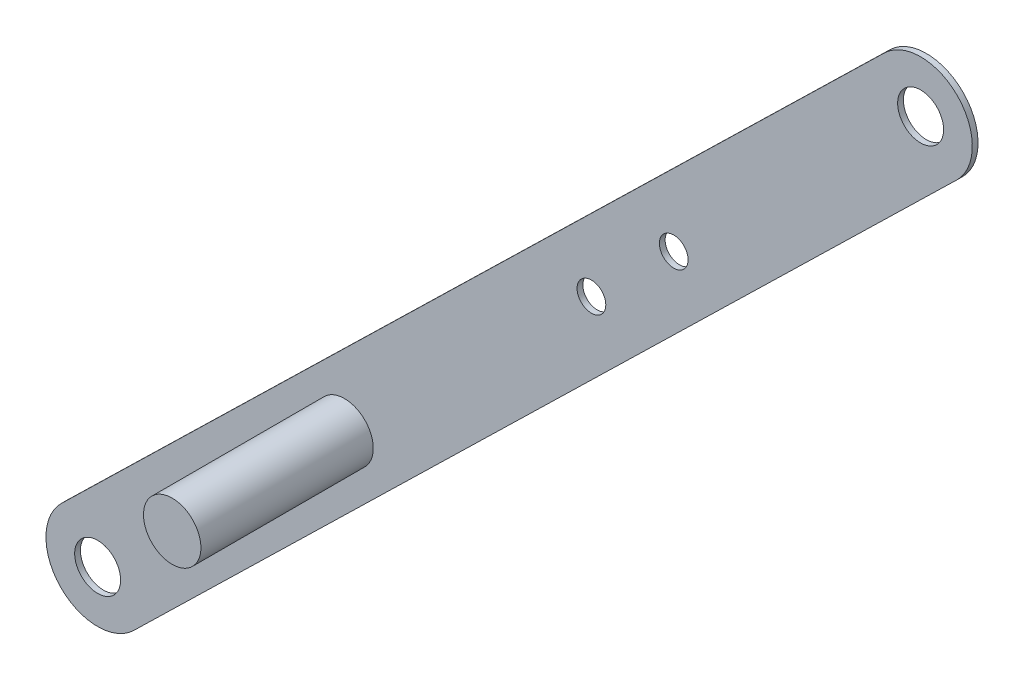
ISO-10303-21;
HEADER;
FILE_DESCRIPTION(('STEP AP214'),'2;1');
FILE_NAME('part.step','',(''),(''),'','','');
FILE_SCHEMA(('AUTOMOTIVE_DESIGN { 1 0 10303 214 1 1 1 1 }'));
ENDSEC;
DATA;
#1=APPLICATION_CONTEXT('core data for automotive mechanical design processes');
#2=APPLICATION_PROTOCOL_DEFINITION('international standard','automotive_design',2000,#1);
#3=PRODUCT_CONTEXT('',#1,'mechanical');
#4=PRODUCT('Part','Part','',(#3));
#5=PRODUCT_RELATED_PRODUCT_CATEGORY('part','',(#4));
#6=PRODUCT_DEFINITION_FORMATION('','',#4);
#7=PRODUCT_DEFINITION_CONTEXT('part definition',#1,'design');
#8=PRODUCT_DEFINITION('design','',#6,#7);
#9=PRODUCT_DEFINITION_SHAPE('','',#8);
#10=(LENGTH_UNIT() NAMED_UNIT(*) SI_UNIT(.MILLI.,.METRE.));
#11=(NAMED_UNIT(*) PLANE_ANGLE_UNIT() SI_UNIT($,.RADIAN.));
#12=(NAMED_UNIT(*) SI_UNIT($,.STERADIAN.) SOLID_ANGLE_UNIT());
#13=UNCERTAINTY_MEASURE_WITH_UNIT(LENGTH_MEASURE(1.E-05),#10,'distance_accuracy_value','');
#14=(GEOMETRIC_REPRESENTATION_CONTEXT(3) GLOBAL_UNCERTAINTY_ASSIGNED_CONTEXT((#13)) GLOBAL_UNIT_ASSIGNED_CONTEXT((#10,
#11,#12)) REPRESENTATION_CONTEXT('',''));
#15=CARTESIAN_POINT('',(0.,0.,0.));
#16=DIRECTION('',(0.,0.,1.));
#17=DIRECTION('',(1.,0.,0.));
#18=AXIS2_PLACEMENT_3D('',#15,#16,#17);
#19=CARTESIAN_POINT('',(0.,0.,1.));
#20=DIRECTION('',(0.,0.,1.));
#21=DIRECTION('',(1.,0.,0.));
#22=AXIS2_PLACEMENT_3D('',#19,#20,#21);
#23=PLANE('',#22);
#24=CARTESIAN_POINT('',(-100.289639049539,-97.6831014009747,1.));
#25=DIRECTION('',(0.,0.,1.));
#26=DIRECTION('',(1.,0.,0.));
#27=AXIS2_PLACEMENT_3D('',#24,#25,#26);
#28=CIRCLE('',#27,5.00000000000001);
#29=CARTESIAN_POINT('',(-95.2896390495394,-97.6831014009747,1.));
#30=VERTEX_POINT('',#29);
#31=EDGE_CURVE('E166',#30,#30,#28,.T.);
#32=ORIENTED_EDGE('',*,*,#31,.F.);
#33=EDGE_LOOP('',(#32));
#34=FACE_BOUND('',#33,.T.);
#35=CARTESIAN_POINT('',(-42.981273878374,-41.8641863147034,1.));
#36=DIRECTION('',(0.,0.,1.));
#37=DIRECTION('',(1.,0.,0.));
#38=AXIS2_PLACEMENT_3D('',#35,#36,#37);
#39=CIRCLE('',#38,2.5);
#40=CARTESIAN_POINT('',(-40.481273878374,-41.8641863147034,1.));
#41=VERTEX_POINT('',#40);
#42=EDGE_CURVE('E146',#41,#41,#39,.T.);
#43=ORIENTED_EDGE('',*,*,#42,.F.);
#44=EDGE_LOOP('',(#43));
#45=FACE_BOUND('',#44,.T.);
#46=CARTESIAN_POINT('',(0.,0.,1.));
#47=DIRECTION('',(0.,0.,1.));
#48=DIRECTION('',(1.,0.,0.));
#49=AXIS2_PLACEMENT_3D('',#46,#47,#48);
#50=CIRCLE('',#49,4.);
#51=CARTESIAN_POINT('',(4.,0.,1.));
#52=VERTEX_POINT('',#51);
#53=EDGE_CURVE('E116',#52,#52,#50,.T.);
#54=ORIENTED_EDGE('',*,*,#53,.F.);
#55=EDGE_LOOP('',(#54));
#56=FACE_BOUND('',#55,.T.);
#57=CARTESIAN_POINT('',(0.,0.,1.));
#58=DIRECTION('',(0.,0.,1.));
#59=DIRECTION('',(1.,0.,0.));
#60=AXIS2_PLACEMENT_3D('',#57,#58,#59);
#61=CIRCLE('',#60,9.00000000000001);
#62=CARTESIAN_POINT('',(6.27962794720552,-6.44719108175611,1.));
#63=VERTEX_POINT('',#62);
#64=CARTESIAN_POINT('',(-6.27962794720552,6.44719108175611,1.));
#65=VERTEX_POINT('',#64);
#66=EDGE_CURVE('E96',#63,#65,#61,.T.);
#67=ORIENTED_EDGE('',*,*,#66,.T.);
#68=DIRECTION('',(-0.716354564639567,-0.697736438578391,0.));
#69=VECTOR('',#68,1.);
#70=CARTESIAN_POINT('',(-6.27962794720552,6.44719108175611,1.));
#71=LINE('',#70,#69);
#72=CARTESIAN_POINT('',(-149.550540875119,-133.100096633922,1.));
#73=VERTEX_POINT('',#72);
#74=EDGE_CURVE('E91',#65,#73,#71,.T.);
#75=ORIENTED_EDGE('',*,*,#74,.T.);
#76=CARTESIAN_POINT('',(-143.270912927913,-139.547287715678,1.));
#77=DIRECTION('',(0.,0.,1.));
#78=DIRECTION('',(1.,0.,0.));
#79=AXIS2_PLACEMENT_3D('',#76,#77,#78);
#80=CIRCLE('',#79,8.99999999999998);
#81=CARTESIAN_POINT('',(-136.991284980708,-145.994478797434,1.));
#82=VERTEX_POINT('',#81);
#83=EDGE_CURVE('E94',#73,#82,#80,.T.);
#84=ORIENTED_EDGE('',*,*,#83,.T.);
#85=DIRECTION('',(0.716354564639567,0.69773643857839,0.));
#86=VECTOR('',#85,1.);
#87=CARTESIAN_POINT('',(6.27962794720552,-6.44719108175611,1.));
#88=LINE('',#87,#86);
#89=EDGE_CURVE('E61',#82,#63,#88,.T.);
#90=ORIENTED_EDGE('',*,*,#89,.T.);
#91=EDGE_LOOP('',(#67,#75,#84,#90));
#92=FACE_BOUND('',#91,.T.);
#93=CARTESIAN_POINT('',(-143.270912927913,-139.547287715678,1.));
#94=DIRECTION('',(0.,0.,1.));
#95=DIRECTION('',(1.,0.,0.));
#96=AXIS2_PLACEMENT_3D('',#93,#94,#95);
#97=CIRCLE('',#96,3.99999999999999);
#98=CARTESIAN_POINT('',(-139.270912927913,-139.547287715678,1.));
#99=VERTEX_POINT('',#98);
#100=EDGE_CURVE('E138',#99,#99,#97,.T.);
#101=ORIENTED_EDGE('',*,*,#100,.F.);
#102=EDGE_LOOP('',(#101));
#103=FACE_BOUND('',#102,.T.);
#104=CARTESIAN_POINT('',(-57.3083651711654,-55.8189150862712,1.));
#105=DIRECTION('',(0.,0.,1.));
#106=DIRECTION('',(1.,0.,0.));
#107=AXIS2_PLACEMENT_3D('',#104,#105,#106);
#108=CIRCLE('',#107,2.5);
#109=CARTESIAN_POINT('',(-54.8083651711654,-55.8189150862712,1.));
#110=VERTEX_POINT('',#109);
#111=EDGE_CURVE('E154',#110,#110,#108,.T.);
#112=ORIENTED_EDGE('',*,*,#111,.F.);
#113=EDGE_LOOP('',(#112));
#114=FACE_BOUND('',#113,.T.);
#115=ADVANCED_FACE('F43',(#34,#45,#56,#92,#103,#114),#23,.T.);
#116=CARTESIAN_POINT('',(0.,0.,0.));
#117=DIRECTION('',(0.,0.,1.));
#118=DIRECTION('',(1.,0.,0.));
#119=AXIS2_PLACEMENT_3D('',#116,#117,#118);
#120=PLANE('',#119);
#121=CARTESIAN_POINT('',(0.,0.,0.));
#122=DIRECTION('',(0.,0.,1.));
#123=DIRECTION('',(1.,0.,0.));
#124=AXIS2_PLACEMENT_3D('',#121,#122,#123);
#125=CIRCLE('',#124,9.00000000000001);
#126=CARTESIAN_POINT('',(6.27962794720552,-6.44719108175611,0.));
#127=VERTEX_POINT('',#126);
#128=CARTESIAN_POINT('',(-6.27962794720552,6.44719108175611,0.));
#129=VERTEX_POINT('',#128);
#130=EDGE_CURVE('E112',#127,#129,#125,.T.);
#131=ORIENTED_EDGE('',*,*,#130,.F.);
#132=DIRECTION('',(0.716354564639567,0.69773643857839,0.));
#133=VECTOR('',#132,1.);
#134=CARTESIAN_POINT('',(6.27962794720552,-6.44719108175611,0.));
#135=LINE('',#134,#133);
#136=CARTESIAN_POINT('',(-136.991284980708,-145.994478797434,0.));
#137=VERTEX_POINT('',#136);
#138=EDGE_CURVE('E84',#137,#127,#135,.T.);
#139=ORIENTED_EDGE('',*,*,#138,.F.);
#140=CARTESIAN_POINT('',(-143.270912927913,-139.547287715678,0.));
#141=DIRECTION('',(0.,0.,1.));
#142=DIRECTION('',(1.,0.,0.));
#143=AXIS2_PLACEMENT_3D('',#140,#141,#142);
#144=CIRCLE('',#143,8.99999999999998);
#145=CARTESIAN_POINT('',(-149.550540875119,-133.100096633922,0.));
#146=VERTEX_POINT('',#145);
#147=EDGE_CURVE('E78',#146,#137,#144,.T.);
#148=ORIENTED_EDGE('',*,*,#147,.F.);
#149=DIRECTION('',(-0.716354564639567,-0.697736438578391,0.));
#150=VECTOR('',#149,1.);
#151=CARTESIAN_POINT('',(-6.27962794720552,6.44719108175611,0.));
#152=LINE('',#151,#150);
#153=EDGE_CURVE('E101',#129,#146,#152,.T.);
#154=ORIENTED_EDGE('',*,*,#153,.F.);
#155=EDGE_LOOP('',(#131,#139,#148,#154));
#156=FACE_BOUND('',#155,.T.);
#157=CARTESIAN_POINT('',(0.,0.,0.));
#158=DIRECTION('',(0.,0.,1.));
#159=DIRECTION('',(1.,0.,0.));
#160=AXIS2_PLACEMENT_3D('',#157,#158,#159);
#161=CIRCLE('',#160,4.);
#162=CARTESIAN_POINT('',(4.,0.,0.));
#163=VERTEX_POINT('',#162);
#164=EDGE_CURVE('E134',#163,#163,#161,.T.);
#165=ORIENTED_EDGE('',*,*,#164,.T.);
#166=EDGE_LOOP('',(#165));
#167=FACE_BOUND('',#166,.T.);
#168=CARTESIAN_POINT('',(-143.270912927913,-139.547287715678,0.));
#169=DIRECTION('',(0.,0.,1.));
#170=DIRECTION('',(1.,0.,0.));
#171=AXIS2_PLACEMENT_3D('',#168,#169,#170);
#172=CIRCLE('',#171,3.99999999999999);
#173=CARTESIAN_POINT('',(-139.270912927913,-139.547287715678,0.));
#174=VERTEX_POINT('',#173);
#175=EDGE_CURVE('E142',#174,#174,#172,.T.);
#176=ORIENTED_EDGE('',*,*,#175,.T.);
#177=EDGE_LOOP('',(#176));
#178=FACE_BOUND('',#177,.T.);
#179=CARTESIAN_POINT('',(-42.981273878374,-41.8641863147034,0.));
#180=DIRECTION('',(0.,0.,1.));
#181=DIRECTION('',(1.,0.,0.));
#182=AXIS2_PLACEMENT_3D('',#179,#180,#181);
#183=CIRCLE('',#182,2.5);
#184=CARTESIAN_POINT('',(-40.481273878374,-41.8641863147034,0.));
#185=VERTEX_POINT('',#184);
#186=EDGE_CURVE('E150',#185,#185,#183,.T.);
#187=ORIENTED_EDGE('',*,*,#186,.T.);
#188=EDGE_LOOP('',(#187));
#189=FACE_BOUND('',#188,.T.);
#190=CARTESIAN_POINT('',(-57.3083651711654,-55.8189150862712,0.));
#191=DIRECTION('',(0.,0.,1.));
#192=DIRECTION('',(1.,0.,0.));
#193=AXIS2_PLACEMENT_3D('',#190,#191,#192);
#194=CIRCLE('',#193,2.5);
#195=CARTESIAN_POINT('',(-54.8083651711654,-55.8189150862712,0.));
#196=VERTEX_POINT('',#195);
#197=EDGE_CURVE('E158',#196,#196,#194,.T.);
#198=ORIENTED_EDGE('',*,*,#197,.T.);
#199=EDGE_LOOP('',(#198));
#200=FACE_BOUND('',#199,.T.);
#201=ADVANCED_FACE('F129',(#156,#167,#178,#189,#200),#120,.F.);
#202=CARTESIAN_POINT('',(0.,0.,1.));
#203=DIRECTION('',(0.,0.,-1.));
#204=DIRECTION('',(-1.,0.,0.));
#205=AXIS2_PLACEMENT_3D('',#202,#203,#204);
#206=CYLINDRICAL_SURFACE('',#205,9.00000000000001);
#207=ORIENTED_EDGE('',*,*,#130,.T.);
#208=DIRECTION('',(0.,0.,-1.));
#209=VECTOR('',#208,1.);
#210=CARTESIAN_POINT('',(-6.27962794720552,6.44719108175611,1.));
#211=LINE('',#210,#209);
#212=EDGE_CURVE('E11',#65,#129,#211,.T.);
#213=ORIENTED_EDGE('',*,*,#212,.F.);
#214=ORIENTED_EDGE('',*,*,#66,.F.);
#215=DIRECTION('',(0.,0.,-1.));
#216=VECTOR('',#215,1.);
#217=CARTESIAN_POINT('',(6.27962794720552,-6.44719108175611,1.));
#218=LINE('',#217,#216);
#219=EDGE_CURVE('E108',#63,#127,#218,.T.);
#220=ORIENTED_EDGE('',*,*,#219,.T.);
#221=EDGE_LOOP('',(#207,#213,#214,#220));
#222=FACE_BOUND('',#221,.T.);
#223=ADVANCED_FACE('F45',(#222),#206,.T.);
#224=CARTESIAN_POINT('',(-6.27962794720552,6.44719108175611,1.));
#225=DIRECTION('',(0.697736438578391,-0.716354564639567,0.));
#226=DIRECTION('',(0.716354564639567,0.697736438578391,0.));
#227=AXIS2_PLACEMENT_3D('',#224,#225,#226);
#228=PLANE('',#227);
#229=ORIENTED_EDGE('',*,*,#153,.T.);
#230=DIRECTION('',(0.,0.,-1.));
#231=VECTOR('',#230,1.);
#232=CARTESIAN_POINT('',(-149.550540875119,-133.100096633922,1.));
#233=LINE('',#232,#231);
#234=EDGE_CURVE('E53',#73,#146,#233,.T.);
#235=ORIENTED_EDGE('',*,*,#234,.F.);
#236=ORIENTED_EDGE('',*,*,#74,.F.);
#237=ORIENTED_EDGE('',*,*,#212,.T.);
#238=EDGE_LOOP('',(#229,#235,#236,#237));
#239=FACE_BOUND('',#238,.T.);
#240=ADVANCED_FACE('F100',(#239),#228,.F.);
#241=CARTESIAN_POINT('',(-143.270912927913,-139.547287715678,1.));
#242=DIRECTION('',(0.,0.,-1.));
#243=DIRECTION('',(-1.,0.,0.));
#244=AXIS2_PLACEMENT_3D('',#241,#242,#243);
#245=CYLINDRICAL_SURFACE('',#244,8.99999999999998);
#246=ORIENTED_EDGE('',*,*,#147,.T.);
#247=DIRECTION('',(0.,0.,-1.));
#248=VECTOR('',#247,1.);
#249=CARTESIAN_POINT('',(-136.991284980708,-145.994478797434,1.));
#250=LINE('',#249,#248);
#251=EDGE_CURVE('E103',#82,#137,#250,.T.);
#252=ORIENTED_EDGE('',*,*,#251,.F.);
#253=ORIENTED_EDGE('',*,*,#83,.F.);
#254=ORIENTED_EDGE('',*,*,#234,.T.);
#255=EDGE_LOOP('',(#246,#252,#253,#254));
#256=FACE_BOUND('',#255,.T.);
#257=ADVANCED_FACE('F104',(#256),#245,.T.);
#258=CARTESIAN_POINT('',(6.27962794720552,-6.44719108175611,1.));
#259=DIRECTION('',(-0.69773643857839,0.716354564639567,0.));
#260=DIRECTION('',(-0.716354564639567,-0.697736438578391,0.));
#261=AXIS2_PLACEMENT_3D('',#258,#259,#260);
#262=PLANE('',#261);
#263=ORIENTED_EDGE('',*,*,#138,.T.);
#264=ORIENTED_EDGE('',*,*,#219,.F.);
#265=ORIENTED_EDGE('',*,*,#89,.F.);
#266=ORIENTED_EDGE('',*,*,#251,.T.);
#267=EDGE_LOOP('',(#263,#264,#265,#266));
#268=FACE_BOUND('',#267,.T.);
#269=ADVANCED_FACE('F126',(#268),#262,.F.);
#270=CARTESIAN_POINT('',(0.,0.,1.));
#271=DIRECTION('',(0.,0.,-1.));
#272=DIRECTION('',(-1.,0.,0.));
#273=AXIS2_PLACEMENT_3D('',#270,#271,#272);
#274=CYLINDRICAL_SURFACE('',#273,4.);
#275=ORIENTED_EDGE('',*,*,#53,.T.);
#276=EDGE_LOOP('',(#275));
#277=FACE_BOUND('',#276,.T.);
#278=ORIENTED_EDGE('',*,*,#164,.F.);
#279=EDGE_LOOP('',(#278));
#280=FACE_BOUND('',#279,.T.);
#281=ADVANCED_FACE('F190',(#277,#280),#274,.F.);
#282=CARTESIAN_POINT('',(-143.270912927913,-139.547287715678,1.));
#283=DIRECTION('',(0.,0.,-1.));
#284=DIRECTION('',(-1.,0.,0.));
#285=AXIS2_PLACEMENT_3D('',#282,#283,#284);
#286=CYLINDRICAL_SURFACE('',#285,3.99999999999999);
#287=ORIENTED_EDGE('',*,*,#100,.T.);
#288=EDGE_LOOP('',(#287));
#289=FACE_BOUND('',#288,.T.);
#290=ORIENTED_EDGE('',*,*,#175,.F.);
#291=EDGE_LOOP('',(#290));
#292=FACE_BOUND('',#291,.T.);
#293=ADVANCED_FACE('F193',(#289,#292),#286,.F.);
#294=CARTESIAN_POINT('',(-42.981273878374,-41.8641863147034,1.));
#295=DIRECTION('',(0.,0.,-1.));
#296=DIRECTION('',(-1.,0.,0.));
#297=AXIS2_PLACEMENT_3D('',#294,#295,#296);
#298=CYLINDRICAL_SURFACE('',#297,2.5);
#299=ORIENTED_EDGE('',*,*,#42,.T.);
#300=EDGE_LOOP('',(#299));
#301=FACE_BOUND('',#300,.T.);
#302=ORIENTED_EDGE('',*,*,#186,.F.);
#303=EDGE_LOOP('',(#302));
#304=FACE_BOUND('',#303,.T.);
#305=ADVANCED_FACE('F206',(#301,#304),#298,.F.);
#306=CARTESIAN_POINT('',(-57.3083651711654,-55.8189150862712,1.));
#307=DIRECTION('',(0.,0.,-1.));
#308=DIRECTION('',(-1.,0.,0.));
#309=AXIS2_PLACEMENT_3D('',#306,#307,#308);
#310=CYLINDRICAL_SURFACE('',#309,2.5);
#311=ORIENTED_EDGE('',*,*,#111,.T.);
#312=EDGE_LOOP('',(#311));
#313=FACE_BOUND('',#312,.T.);
#314=ORIENTED_EDGE('',*,*,#197,.F.);
#315=EDGE_LOOP('',(#314));
#316=FACE_BOUND('',#315,.T.);
#317=ADVANCED_FACE('F179',(#313,#316),#310,.F.);
#318=CARTESIAN_POINT('',(-100.289639049539,-97.6831014009747,31.));
#319=DIRECTION('',(0.,0.,-1.));
#320=DIRECTION('',(-1.,0.,0.));
#321=AXIS2_PLACEMENT_3D('',#318,#319,#320);
#322=CYLINDRICAL_SURFACE('',#321,5.00000000000001);
#323=CARTESIAN_POINT('',(-100.289639049539,-97.6831014009747,31.));
#324=DIRECTION('',(0.,0.,1.));
#325=DIRECTION('',(1.,0.,0.));
#326=AXIS2_PLACEMENT_3D('',#323,#324,#325);
#327=CIRCLE('',#326,5.00000000000001);
#328=CARTESIAN_POINT('',(-95.2896390495394,-97.6831014009747,31.));
#329=VERTEX_POINT('',#328);
#330=EDGE_CURVE('E162',#329,#329,#327,.T.);
#331=ORIENTED_EDGE('',*,*,#330,.F.);
#332=EDGE_LOOP('',(#331));
#333=FACE_BOUND('',#332,.T.);
#334=ORIENTED_EDGE('',*,*,#31,.T.);
#335=EDGE_LOOP('',(#334));
#336=FACE_BOUND('',#335,.T.);
#337=ADVANCED_FACE('F176',(#333,#336),#322,.T.);
#338=CARTESIAN_POINT('',(-100.289639049539,-97.6831014009747,31.));
#339=DIRECTION('',(0.,0.,1.));
#340=DIRECTION('',(1.,0.,0.));
#341=AXIS2_PLACEMENT_3D('',#338,#339,#340);
#342=PLANE('',#341);
#343=ORIENTED_EDGE('',*,*,#330,.T.);
#344=EDGE_LOOP('',(#343));
#345=FACE_BOUND('',#344,.T.);
#346=ADVANCED_FACE('F174',(#345),#342,.T.);
#347=CLOSED_SHELL('',(#115,#201,#223,#240,#257,#269,#281,#293,#305,#317,#337,#346));
#348=MANIFOLD_SOLID_BREP('B2',#347);
#349=ADVANCED_BREP_SHAPE_REPRESENTATION('',(#18,#348),#14);
#350=SHAPE_DEFINITION_REPRESENTATION(#9,#349);
ENDSEC;
END-ISO-10303-21;
